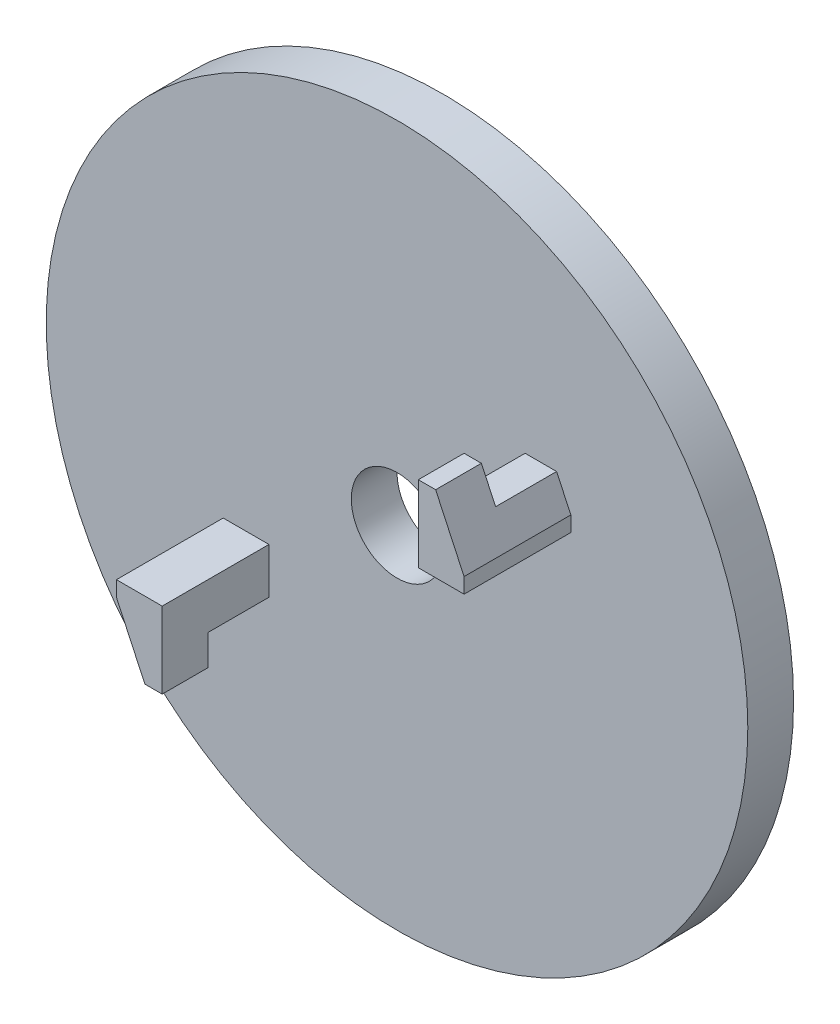
ISO-10303-21;
HEADER;
FILE_DESCRIPTION(('STEP AP214'),'2;1');
FILE_NAME('part.step','',(''),(''),'','','');
FILE_SCHEMA(('AUTOMOTIVE_DESIGN { 1 0 10303 214 1 1 1 1 }'));
ENDSEC;
DATA;
#1=APPLICATION_CONTEXT('core data for automotive mechanical design processes');
#2=APPLICATION_PROTOCOL_DEFINITION('international standard','automotive_design',2000,#1);
#3=PRODUCT_CONTEXT('',#1,'mechanical');
#4=PRODUCT('Part','Part','',(#3));
#5=PRODUCT_RELATED_PRODUCT_CATEGORY('part','',(#4));
#6=PRODUCT_DEFINITION_FORMATION('','',#4);
#7=PRODUCT_DEFINITION_CONTEXT('part definition',#1,'design');
#8=PRODUCT_DEFINITION('design','',#6,#7);
#9=PRODUCT_DEFINITION_SHAPE('','',#8);
#10=(LENGTH_UNIT() NAMED_UNIT(*) SI_UNIT(.MILLI.,.METRE.));
#11=(NAMED_UNIT(*) PLANE_ANGLE_UNIT() SI_UNIT($,.RADIAN.));
#12=(NAMED_UNIT(*) SI_UNIT($,.STERADIAN.) SOLID_ANGLE_UNIT());
#13=UNCERTAINTY_MEASURE_WITH_UNIT(LENGTH_MEASURE(1.E-05),#10,'distance_accuracy_value','');
#14=(GEOMETRIC_REPRESENTATION_CONTEXT(3) GLOBAL_UNCERTAINTY_ASSIGNED_CONTEXT((#13)) GLOBAL_UNIT_ASSIGNED_CONTEXT((#10,
#11,#12)) REPRESENTATION_CONTEXT('',''));
#15=CARTESIAN_POINT('',(0.,0.,0.));
#16=DIRECTION('',(0.,0.,1.));
#17=DIRECTION('',(1.,0.,0.));
#18=AXIS2_PLACEMENT_3D('',#15,#16,#17);
#19=CARTESIAN_POINT('',(-5.69834179168338,-4.14321580697128,5.));
#20=DIRECTION('',(0.,1.,0.));
#21=DIRECTION('',(0.,0.,1.));
#22=AXIS2_PLACEMENT_3D('',#19,#20,#21);
#23=PLANE('',#22);
#24=DIRECTION('',(1.,0.,0.));
#25=VECTOR('',#24,1.);
#26=CARTESIAN_POINT('',(-4.19834179168338,-4.14321580697128,3.5));
#27=LINE('',#26,#25);
#28=CARTESIAN_POINT('',(-5.23203413352837,-4.14321580697128,3.5));
#29=VERTEX_POINT('',#28);
#30=CARTESIAN_POINT('',(-4.19834179168338,-4.14321580697128,3.5));
#31=VERTEX_POINT('',#30);
#32=EDGE_CURVE('E170',#29,#31,#27,.T.);
#33=ORIENTED_EDGE('',*,*,#32,.F.);
#34=DIRECTION('',(0.,0.,1.));
#35=VECTOR('',#34,1.);
#36=CARTESIAN_POINT('',(-5.23203413352837,-4.14321580697128,0.));
#37=LINE('',#36,#35);
#38=CARTESIAN_POINT('',(-5.23203413352837,-4.14321580697128,1.5));
#39=VERTEX_POINT('',#38);
#40=EDGE_CURVE('E300',#29,#39,#37,.F.);
#41=ORIENTED_EDGE('',*,*,#40,.T.);
#42=DIRECTION('',(1.,0.,0.));
#43=VECTOR('',#42,1.);
#44=CARTESIAN_POINT('',(-5.69834179168338,-4.14321580697128,1.5));
#45=LINE('',#44,#43);
#46=CARTESIAN_POINT('',(-4.19834179168338,-4.14321580697128,1.5));
#47=VERTEX_POINT('',#46);
#48=EDGE_CURVE('E154',#39,#47,#45,.T.);
#49=ORIENTED_EDGE('',*,*,#48,.T.);
#50=DIRECTION('',(0.,0.,-1.));
#51=VECTOR('',#50,1.);
#52=CARTESIAN_POINT('',(-4.19834179168338,-4.14321580697128,5.));
#53=LINE('',#52,#51);
#54=EDGE_CURVE('E204',#31,#47,#53,.T.);
#55=ORIENTED_EDGE('',*,*,#54,.F.);
#56=EDGE_LOOP('',(#33,#41,#49,#55));
#57=FACE_BOUND('',#56,.T.);
#58=ADVANCED_FACE('F39',(#57),#23,.F.);
#59=CARTESIAN_POINT('',(4.19834179168338,4.14321580697128,5.));
#60=DIRECTION('',(0.,-1.,0.));
#61=DIRECTION('',(0.,0.,-1.));
#62=AXIS2_PLACEMENT_3D('',#59,#60,#61);
#63=PLANE('',#62);
#64=DIRECTION('',(-1.,0.,0.));
#65=VECTOR('',#64,1.);
#66=CARTESIAN_POINT('',(5.69834179168338,4.14321580697128,3.5));
#67=LINE('',#66,#65);
#68=CARTESIAN_POINT('',(5.23203413352838,4.14321580697128,3.5));
#69=VERTEX_POINT('',#68);
#70=CARTESIAN_POINT('',(4.19834179168338,4.14321580697128,3.5));
#71=VERTEX_POINT('',#70);
#72=EDGE_CURVE('E180',#69,#71,#67,.T.);
#73=ORIENTED_EDGE('',*,*,#72,.F.);
#74=DIRECTION('',(0.,0.,-1.));
#75=VECTOR('',#74,1.);
#76=CARTESIAN_POINT('',(5.23203413352838,4.14321580697128,0.));
#77=LINE('',#76,#75);
#78=CARTESIAN_POINT('',(5.23203413352838,4.14321580697128,1.5));
#79=VERTEX_POINT('',#78);
#80=EDGE_CURVE('E282',#69,#79,#77,.T.);
#81=ORIENTED_EDGE('',*,*,#80,.T.);
#82=DIRECTION('',(-1.,0.,0.));
#83=VECTOR('',#82,1.);
#84=CARTESIAN_POINT('',(4.19834179168338,4.14321580697128,1.5));
#85=LINE('',#84,#83);
#86=CARTESIAN_POINT('',(4.19834179168338,4.14321580697128,1.5));
#87=VERTEX_POINT('',#86);
#88=EDGE_CURVE('E240',#79,#87,#85,.T.);
#89=ORIENTED_EDGE('',*,*,#88,.T.);
#90=DIRECTION('',(0.,0.,-1.));
#91=VECTOR('',#90,1.);
#92=CARTESIAN_POINT('',(4.19834179168338,4.14321580697128,5.));
#93=LINE('',#92,#91);
#94=EDGE_CURVE('E255',#71,#87,#93,.T.);
#95=ORIENTED_EDGE('',*,*,#94,.F.);
#96=EDGE_LOOP('',(#73,#81,#89,#95));
#97=FACE_BOUND('',#96,.T.);
#98=ADVANCED_FACE('F330',(#97),#63,.F.);
#99=CARTESIAN_POINT('',(0.,0.,1.5));
#100=DIRECTION('',(0.,0.,1.));
#101=DIRECTION('',(1.,0.,0.));
#102=AXIS2_PLACEMENT_3D('',#99,#100,#101);
#103=PLANE('',#102);
#104=CARTESIAN_POINT('',(0.,0.,1.5));
#105=DIRECTION('',(0.,0.,1.));
#106=DIRECTION('',(1.,0.,0.));
#107=AXIS2_PLACEMENT_3D('',#104,#105,#106);
#108=CIRCLE('',#107,11.5);
#109=CARTESIAN_POINT('',(11.5,0.,1.5));
#110=VERTEX_POINT('',#109);
#111=EDGE_CURVE('E268',#110,#110,#108,.T.);
#112=ORIENTED_EDGE('',*,*,#111,.T.);
#113=EDGE_LOOP('',(#112));
#114=FACE_BOUND('',#113,.T.);
#115=CARTESIAN_POINT('',(0.,0.,1.5));
#116=DIRECTION('',(0.,0.,1.));
#117=DIRECTION('',(1.,0.,0.));
#118=AXIS2_PLACEMENT_3D('',#115,#116,#117);
#119=CIRCLE('',#118,1.5);
#120=CARTESIAN_POINT('',(1.5,0.,1.5));
#121=VERTEX_POINT('',#120);
#122=EDGE_CURVE('E260',#121,#121,#119,.T.);
#123=ORIENTED_EDGE('',*,*,#122,.F.);
#124=EDGE_LOOP('',(#123));
#125=FACE_BOUND('',#124,.T.);
#126=ORIENTED_EDGE('',*,*,#88,.F.);
#127=DIRECTION('',(0.422618261740697,-0.906307787036651,0.));
#128=VECTOR('',#127,1.);
#129=CARTESIAN_POINT('',(4.76572647537338,5.14321580697128,1.5));
#130=LINE('',#129,#128);
#131=CARTESIAN_POINT('',(5.69834179168338,3.14321580697126,1.5));
#132=VERTEX_POINT('',#131);
#133=EDGE_CURVE('E291',#79,#132,#130,.T.);
#134=ORIENTED_EDGE('',*,*,#133,.T.);
#135=DIRECTION('',(0.,1.,0.));
#136=VECTOR('',#135,1.);
#137=CARTESIAN_POINT('',(5.69834179168338,4.14321580697128,1.5));
#138=LINE('',#137,#136);
#139=CARTESIAN_POINT('',(5.69834179168338,2.64321580697128,1.5));
#140=VERTEX_POINT('',#139);
#141=EDGE_CURVE('E224',#140,#132,#138,.T.);
#142=ORIENTED_EDGE('',*,*,#141,.F.);
#143=DIRECTION('',(1.,0.,0.));
#144=VECTOR('',#143,1.);
#145=CARTESIAN_POINT('',(4.19834179168338,2.64321580697128,1.5));
#146=LINE('',#145,#144);
#147=CARTESIAN_POINT('',(4.19834179168338,2.64321580697128,1.5));
#148=VERTEX_POINT('',#147);
#149=EDGE_CURVE('E230',#148,#140,#146,.T.);
#150=ORIENTED_EDGE('',*,*,#149,.F.);
#151=DIRECTION('',(0.,-1.,0.));
#152=VECTOR('',#151,1.);
#153=CARTESIAN_POINT('',(4.19834179168338,4.14321580697128,1.5));
#154=LINE('',#153,#152);
#155=EDGE_CURVE('E243',#87,#148,#154,.T.);
#156=ORIENTED_EDGE('',*,*,#155,.F.);
#157=EDGE_LOOP('',(#126,#134,#142,#150,#156));
#158=FACE_BOUND('',#157,.T.);
#159=DIRECTION('',(-1.,0.,0.));
#160=VECTOR('',#159,1.);
#161=CARTESIAN_POINT('',(-5.69834179168338,-2.64321580697128,1.5));
#162=LINE('',#161,#160);
#163=CARTESIAN_POINT('',(-4.19834179168338,-2.64321580697128,1.5));
#164=VERTEX_POINT('',#163);
#165=CARTESIAN_POINT('',(-5.69834179168338,-2.64321580697128,1.5));
#166=VERTEX_POINT('',#165);
#167=EDGE_CURVE('E207',#164,#166,#162,.T.);
#168=ORIENTED_EDGE('',*,*,#167,.F.);
#169=DIRECTION('',(0.,1.,0.));
#170=VECTOR('',#169,1.);
#171=CARTESIAN_POINT('',(-4.19834179168338,-2.64321580697128,1.5));
#172=LINE('',#171,#170);
#173=EDGE_CURVE('E197',#47,#164,#172,.T.);
#174=ORIENTED_EDGE('',*,*,#173,.F.);
#175=ORIENTED_EDGE('',*,*,#48,.F.);
#176=DIRECTION('',(0.422618261740697,-0.906307787036651,0.));
#177=VECTOR('',#176,1.);
#178=CARTESIAN_POINT('',(-4.76572647537338,-5.14321580697128,1.5));
#179=LINE('',#178,#177);
#180=CARTESIAN_POINT('',(-5.69834179168338,-3.14321580697126,1.5));
#181=VERTEX_POINT('',#180);
#182=EDGE_CURVE('E11',#39,#181,#179,.F.);
#183=ORIENTED_EDGE('',*,*,#182,.T.);
#184=DIRECTION('',(0.,-1.,0.));
#185=VECTOR('',#184,1.);
#186=CARTESIAN_POINT('',(-5.69834179168338,-2.64321580697128,1.5));
#187=LINE('',#186,#185);
#188=EDGE_CURVE('E210',#166,#181,#187,.T.);
#189=ORIENTED_EDGE('',*,*,#188,.F.);
#190=EDGE_LOOP('',(#168,#174,#175,#183,#189));
#191=FACE_BOUND('',#190,.T.);
#192=ADVANCED_FACE('F312',(#114,#125,#158,#191),#103,.T.);
#193=CARTESIAN_POINT('',(0.,0.,0.));
#194=DIRECTION('',(0.,0.,1.));
#195=DIRECTION('',(1.,0.,0.));
#196=AXIS2_PLACEMENT_3D('',#193,#194,#195);
#197=PLANE('',#196);
#198=CARTESIAN_POINT('',(0.,0.,0.));
#199=DIRECTION('',(0.,0.,1.));
#200=DIRECTION('',(1.,0.,0.));
#201=AXIS2_PLACEMENT_3D('',#198,#199,#200);
#202=CIRCLE('',#201,11.5);
#203=CARTESIAN_POINT('',(11.5,0.,0.));
#204=VERTEX_POINT('',#203);
#205=EDGE_CURVE('E264',#204,#204,#202,.T.);
#206=ORIENTED_EDGE('',*,*,#205,.F.);
#207=EDGE_LOOP('',(#206));
#208=FACE_BOUND('',#207,.T.);
#209=CARTESIAN_POINT('',(0.,0.,0.));
#210=DIRECTION('',(0.,0.,1.));
#211=DIRECTION('',(1.,0.,0.));
#212=AXIS2_PLACEMENT_3D('',#209,#210,#211);
#213=CIRCLE('',#212,1.5);
#214=CARTESIAN_POINT('',(1.5,0.,0.));
#215=VERTEX_POINT('',#214);
#216=EDGE_CURVE('E259',#215,#215,#213,.T.);
#217=ORIENTED_EDGE('',*,*,#216,.T.);
#218=EDGE_LOOP('',(#217));
#219=FACE_BOUND('',#218,.T.);
#220=ADVANCED_FACE('F385',(#208,#219),#197,.F.);
#221=CARTESIAN_POINT('',(0.,0.,1.5));
#222=DIRECTION('',(0.,0.,-1.));
#223=DIRECTION('',(-1.,0.,0.));
#224=AXIS2_PLACEMENT_3D('',#221,#222,#223);
#225=CYLINDRICAL_SURFACE('',#224,11.5);
#226=ORIENTED_EDGE('',*,*,#111,.F.);
#227=EDGE_LOOP('',(#226));
#228=FACE_BOUND('',#227,.T.);
#229=ORIENTED_EDGE('',*,*,#205,.T.);
#230=EDGE_LOOP('',(#229));
#231=FACE_BOUND('',#230,.T.);
#232=ADVANCED_FACE('F484',(#228,#231),#225,.T.);
#233=CARTESIAN_POINT('',(0.,0.,1.5));
#234=DIRECTION('',(0.,0.,-1.));
#235=DIRECTION('',(-1.,0.,0.));
#236=AXIS2_PLACEMENT_3D('',#233,#234,#235);
#237=CYLINDRICAL_SURFACE('',#236,1.5);
#238=ORIENTED_EDGE('',*,*,#122,.T.);
#239=EDGE_LOOP('',(#238));
#240=FACE_BOUND('',#239,.T.);
#241=ORIENTED_EDGE('',*,*,#216,.F.);
#242=EDGE_LOOP('',(#241));
#243=FACE_BOUND('',#242,.T.);
#244=ADVANCED_FACE('F446',(#240,#243),#237,.F.);
#245=CARTESIAN_POINT('',(5.69834179168338,4.14321580697128,5.));
#246=DIRECTION('',(-1.,0.,0.));
#247=DIRECTION('',(0.,-1.,0.));
#248=AXIS2_PLACEMENT_3D('',#245,#246,#247);
#249=PLANE('',#248);
#250=ORIENTED_EDGE('',*,*,#141,.T.);
#251=DIRECTION('',(0.,0.,1.));
#252=VECTOR('',#251,1.);
#253=CARTESIAN_POINT('',(5.69834179168338,3.14321580697126,5.));
#254=LINE('',#253,#252);
#255=CARTESIAN_POINT('',(5.69834179168338,3.14321580697126,5.));
#256=VERTEX_POINT('',#255);
#257=EDGE_CURVE('E285',#132,#256,#254,.T.);
#258=ORIENTED_EDGE('',*,*,#257,.T.);
#259=DIRECTION('',(0.,1.,0.));
#260=VECTOR('',#259,1.);
#261=CARTESIAN_POINT('',(5.69834179168338,4.14321580697128,5.));
#262=LINE('',#261,#260);
#263=CARTESIAN_POINT('',(5.69834179168338,2.64321580697128,5.));
#264=VERTEX_POINT('',#263);
#265=EDGE_CURVE('E225',#264,#256,#262,.T.);
#266=ORIENTED_EDGE('',*,*,#265,.F.);
#267=DIRECTION('',(0.,0.,-1.));
#268=VECTOR('',#267,1.);
#269=CARTESIAN_POINT('',(5.69834179168338,2.64321580697128,5.));
#270=LINE('',#269,#268);
#271=EDGE_CURVE('E236',#264,#140,#270,.T.);
#272=ORIENTED_EDGE('',*,*,#271,.T.);
#273=EDGE_LOOP('',(#250,#258,#266,#272));
#274=FACE_BOUND('',#273,.T.);
#275=ADVANCED_FACE('F440',(#274),#249,.F.);
#276=CARTESIAN_POINT('',(4.19834179168338,4.14321580697128,5.));
#277=DIRECTION('',(1.,0.,0.));
#278=DIRECTION('',(0.,0.,-1.));
#279=AXIS2_PLACEMENT_3D('',#276,#277,#278);
#280=PLANE('',#279);
#281=ORIENTED_EDGE('',*,*,#155,.T.);
#282=DIRECTION('',(0.,0.,-1.));
#283=VECTOR('',#282,1.);
#284=CARTESIAN_POINT('',(4.19834179168338,2.64321580697128,5.));
#285=LINE('',#284,#283);
#286=CARTESIAN_POINT('',(4.19834179168338,2.64321580697128,5.));
#287=VERTEX_POINT('',#286);
#288=EDGE_CURVE('E252',#287,#148,#285,.T.);
#289=ORIENTED_EDGE('',*,*,#288,.F.);
#290=DIRECTION('',(0.,-1.,0.));
#291=VECTOR('',#290,1.);
#292=CARTESIAN_POINT('',(4.19834179168338,4.14321580697128,5.));
#293=LINE('',#292,#291);
#294=CARTESIAN_POINT('',(4.19834179168338,5.14321580697128,5.));
#295=VERTEX_POINT('',#294);
#296=EDGE_CURVE('E229',#295,#287,#293,.T.);
#297=ORIENTED_EDGE('',*,*,#296,.F.);
#298=DIRECTION('',(0.,0.,1.));
#299=VECTOR('',#298,1.);
#300=CARTESIAN_POINT('',(4.19834179168338,5.14321580697128,5.));
#301=LINE('',#300,#299);
#302=CARTESIAN_POINT('',(4.19834179168338,5.14321580697128,3.5));
#303=VERTEX_POINT('',#302);
#304=EDGE_CURVE('E184',#303,#295,#301,.T.);
#305=ORIENTED_EDGE('',*,*,#304,.F.);
#306=DIRECTION('',(0.,-1.,0.));
#307=VECTOR('',#306,1.);
#308=CARTESIAN_POINT('',(4.19834179168338,5.14321580697128,3.5));
#309=LINE('',#308,#307);
#310=EDGE_CURVE('E192',#303,#71,#309,.T.);
#311=ORIENTED_EDGE('',*,*,#310,.T.);
#312=ORIENTED_EDGE('',*,*,#94,.T.);
#313=EDGE_LOOP('',(#281,#289,#297,#305,#311,#312));
#314=FACE_BOUND('',#313,.T.);
#315=ADVANCED_FACE('F445',(#314),#280,.F.);
#316=CARTESIAN_POINT('',(4.19834179168338,2.64321580697128,5.));
#317=DIRECTION('',(0.,1.,0.));
#318=DIRECTION('',(0.,0.,1.));
#319=AXIS2_PLACEMENT_3D('',#316,#317,#318);
#320=PLANE('',#319);
#321=ORIENTED_EDGE('',*,*,#149,.T.);
#322=ORIENTED_EDGE('',*,*,#271,.F.);
#323=DIRECTION('',(1.,0.,0.));
#324=VECTOR('',#323,1.);
#325=CARTESIAN_POINT('',(4.19834179168338,2.64321580697128,5.));
#326=LINE('',#325,#324);
#327=EDGE_CURVE('E233',#287,#264,#326,.T.);
#328=ORIENTED_EDGE('',*,*,#327,.F.);
#329=ORIENTED_EDGE('',*,*,#288,.T.);
#330=EDGE_LOOP('',(#321,#322,#328,#329));
#331=FACE_BOUND('',#330,.T.);
#332=ADVANCED_FACE('F431',(#331),#320,.F.);
#333=CARTESIAN_POINT('',(0.,0.,5.));
#334=DIRECTION('',(0.,0.,1.));
#335=DIRECTION('',(1.,0.,0.));
#336=AXIS2_PLACEMENT_3D('',#333,#334,#335);
#337=PLANE('',#336);
#338=ORIENTED_EDGE('',*,*,#265,.T.);
#339=DIRECTION('',(-0.422618261740697,0.906307787036651,0.));
#340=VECTOR('',#339,1.);
#341=CARTESIAN_POINT('',(5.88450414679527,2.74398934809546,5.));
#342=LINE('',#341,#340);
#343=CARTESIAN_POINT('',(4.76572647537338,5.14321580697128,5.));
#344=VERTEX_POINT('',#343);
#345=EDGE_CURVE('E288',#256,#344,#342,.T.);
#346=ORIENTED_EDGE('',*,*,#345,.T.);
#347=DIRECTION('',(1.,0.,0.));
#348=VECTOR('',#347,1.);
#349=CARTESIAN_POINT('',(5.69834179168338,5.14321580697128,5.));
#350=LINE('',#349,#348);
#351=EDGE_CURVE('E188',#295,#344,#350,.T.);
#352=ORIENTED_EDGE('',*,*,#351,.F.);
#353=ORIENTED_EDGE('',*,*,#296,.T.);
#354=ORIENTED_EDGE('',*,*,#327,.T.);
#355=EDGE_LOOP('',(#338,#346,#352,#353,#354));
#356=FACE_BOUND('',#355,.T.);
#357=ADVANCED_FACE('F403',(#356),#337,.T.);
#358=CARTESIAN_POINT('',(-4.19834179168338,-2.64321580697128,5.));
#359=DIRECTION('',(-1.,0.,0.));
#360=DIRECTION('',(0.,0.,1.));
#361=AXIS2_PLACEMENT_3D('',#358,#359,#360);
#362=PLANE('',#361);
#363=ORIENTED_EDGE('',*,*,#173,.T.);
#364=DIRECTION('',(0.,0.,-1.));
#365=VECTOR('',#364,1.);
#366=CARTESIAN_POINT('',(-4.19834179168338,-2.64321580697128,5.));
#367=LINE('',#366,#365);
#368=CARTESIAN_POINT('',(-4.19834179168338,-2.64321580697128,5.));
#369=VERTEX_POINT('',#368);
#370=EDGE_CURVE('E150',#369,#164,#367,.T.);
#371=ORIENTED_EDGE('',*,*,#370,.F.);
#372=DIRECTION('',(0.,1.,0.));
#373=VECTOR('',#372,1.);
#374=CARTESIAN_POINT('',(-4.19834179168338,-2.64321580697128,5.));
#375=LINE('',#374,#373);
#376=CARTESIAN_POINT('',(-4.19834179168338,-5.14321580697128,5.));
#377=VERTEX_POINT('',#376);
#378=EDGE_CURVE('E143',#377,#369,#375,.T.);
#379=ORIENTED_EDGE('',*,*,#378,.F.);
#380=DIRECTION('',(0.,0.,1.));
#381=VECTOR('',#380,1.);
#382=CARTESIAN_POINT('',(-4.19834179168338,-5.14321580697128,5.));
#383=LINE('',#382,#381);
#384=CARTESIAN_POINT('',(-4.19834179168338,-5.14321580697128,3.5));
#385=VERTEX_POINT('',#384);
#386=EDGE_CURVE('E149',#385,#377,#383,.T.);
#387=ORIENTED_EDGE('',*,*,#386,.F.);
#388=DIRECTION('',(0.,1.,0.));
#389=VECTOR('',#388,1.);
#390=CARTESIAN_POINT('',(-4.19834179168338,-5.14321580697128,3.5));
#391=LINE('',#390,#389);
#392=EDGE_CURVE('E176',#385,#31,#391,.T.);
#393=ORIENTED_EDGE('',*,*,#392,.T.);
#394=ORIENTED_EDGE('',*,*,#54,.T.);
#395=EDGE_LOOP('',(#363,#371,#379,#387,#393,#394));
#396=FACE_BOUND('',#395,.T.);
#397=ADVANCED_FACE('F146',(#396),#362,.F.);
#398=CARTESIAN_POINT('',(-5.69834179168338,-2.64321580697128,5.));
#399=DIRECTION('',(0.,-1.,0.));
#400=DIRECTION('',(0.,0.,-1.));
#401=AXIS2_PLACEMENT_3D('',#398,#399,#400);
#402=PLANE('',#401);
#403=ORIENTED_EDGE('',*,*,#167,.T.);
#404=DIRECTION('',(0.,0.,-1.));
#405=VECTOR('',#404,1.);
#406=CARTESIAN_POINT('',(-5.69834179168338,-2.64321580697128,5.));
#407=LINE('',#406,#405);
#408=CARTESIAN_POINT('',(-5.69834179168338,-2.64321580697128,5.));
#409=VERTEX_POINT('',#408);
#410=EDGE_CURVE('E218',#409,#166,#407,.T.);
#411=ORIENTED_EDGE('',*,*,#410,.F.);
#412=DIRECTION('',(-1.,0.,0.));
#413=VECTOR('',#412,1.);
#414=CARTESIAN_POINT('',(-5.69834179168338,-2.64321580697128,5.));
#415=LINE('',#414,#413);
#416=EDGE_CURVE('E153',#369,#409,#415,.T.);
#417=ORIENTED_EDGE('',*,*,#416,.F.);
#418=ORIENTED_EDGE('',*,*,#370,.T.);
#419=EDGE_LOOP('',(#403,#411,#417,#418));
#420=FACE_BOUND('',#419,.T.);
#421=ADVANCED_FACE('F317',(#420),#402,.F.);
#422=CARTESIAN_POINT('',(-5.69834179168338,-2.64321580697128,5.));
#423=DIRECTION('',(1.,0.,0.));
#424=DIRECTION('',(0.,0.,-1.));
#425=AXIS2_PLACEMENT_3D('',#422,#423,#424);
#426=PLANE('',#425);
#427=ORIENTED_EDGE('',*,*,#188,.T.);
#428=DIRECTION('',(0.,0.,1.));
#429=VECTOR('',#428,1.);
#430=CARTESIAN_POINT('',(-5.69834179168338,-3.14321580697126,5.));
#431=LINE('',#430,#429);
#432=CARTESIAN_POINT('',(-5.69834179168338,-3.14321580697126,5.));
#433=VERTEX_POINT('',#432);
#434=EDGE_CURVE('E55',#181,#433,#431,.T.);
#435=ORIENTED_EDGE('',*,*,#434,.T.);
#436=DIRECTION('',(0.,-1.,0.));
#437=VECTOR('',#436,1.);
#438=CARTESIAN_POINT('',(-5.69834179168338,-2.64321580697128,5.));
#439=LINE('',#438,#437);
#440=EDGE_CURVE('E201',#409,#433,#439,.T.);
#441=ORIENTED_EDGE('',*,*,#440,.F.);
#442=ORIENTED_EDGE('',*,*,#410,.T.);
#443=EDGE_LOOP('',(#427,#435,#441,#442));
#444=FACE_BOUND('',#443,.T.);
#445=ADVANCED_FACE('F318',(#444),#426,.F.);
#446=CARTESIAN_POINT('',(0.,0.,5.));
#447=DIRECTION('',(0.,0.,1.));
#448=DIRECTION('',(1.,0.,0.));
#449=AXIS2_PLACEMENT_3D('',#446,#447,#448);
#450=PLANE('',#449);
#451=ORIENTED_EDGE('',*,*,#440,.T.);
#452=DIRECTION('',(-0.422618261740697,0.906307787036651,0.));
#453=VECTOR('',#452,1.);
#454=CARTESIAN_POINT('',(-5.88450414679526,-2.74398934809546,5.));
#455=LINE('',#454,#453);
#456=CARTESIAN_POINT('',(-4.76572647537338,-5.14321580697128,5.));
#457=VERTEX_POINT('',#456);
#458=EDGE_CURVE('E48',#433,#457,#455,.F.);
#459=ORIENTED_EDGE('',*,*,#458,.T.);
#460=DIRECTION('',(-1.,0.,0.));
#461=VECTOR('',#460,1.);
#462=CARTESIAN_POINT('',(-4.19834179168338,-5.14321580697128,5.));
#463=LINE('',#462,#461);
#464=EDGE_CURVE('E157',#377,#457,#463,.T.);
#465=ORIENTED_EDGE('',*,*,#464,.F.);
#466=ORIENTED_EDGE('',*,*,#378,.T.);
#467=ORIENTED_EDGE('',*,*,#416,.T.);
#468=EDGE_LOOP('',(#451,#459,#465,#466,#467));
#469=FACE_BOUND('',#468,.T.);
#470=ADVANCED_FACE('F158',(#469),#450,.T.);
#471=CARTESIAN_POINT('',(5.69834179168338,5.14321580697128,3.5));
#472=DIRECTION('',(0.,0.,1.));
#473=DIRECTION('',(1.,0.,0.));
#474=AXIS2_PLACEMENT_3D('',#471,#472,#473);
#475=PLANE('',#474);
#476=DIRECTION('',(-1.,0.,0.));
#477=VECTOR('',#476,1.);
#478=CARTESIAN_POINT('',(5.69834179168338,5.14321580697128,3.5));
#479=LINE('',#478,#477);
#480=CARTESIAN_POINT('',(4.76572647537338,5.14321580697128,3.5));
#481=VERTEX_POINT('',#480);
#482=EDGE_CURVE('E181',#481,#303,#479,.T.);
#483=ORIENTED_EDGE('',*,*,#482,.F.);
#484=DIRECTION('',(0.422618261740697,-0.906307787036651,0.));
#485=VECTOR('',#484,1.);
#486=CARTESIAN_POINT('',(4.76572647537338,5.14321580697128,3.5));
#487=LINE('',#486,#485);
#488=EDGE_CURVE('E279',#481,#69,#487,.T.);
#489=ORIENTED_EDGE('',*,*,#488,.T.);
#490=ORIENTED_EDGE('',*,*,#72,.T.);
#491=ORIENTED_EDGE('',*,*,#310,.F.);
#492=EDGE_LOOP('',(#483,#489,#490,#491));
#493=FACE_BOUND('',#492,.T.);
#494=ADVANCED_FACE('F325',(#493),#475,.F.);
#495=CARTESIAN_POINT('',(0.,5.14321580697128,0.));
#496=DIRECTION('',(0.,1.,0.));
#497=DIRECTION('',(0.,0.,1.));
#498=AXIS2_PLACEMENT_3D('',#495,#496,#497);
#499=PLANE('',#498);
#500=ORIENTED_EDGE('',*,*,#351,.T.);
#501=DIRECTION('',(0.,0.,-1.));
#502=VECTOR('',#501,1.);
#503=CARTESIAN_POINT('',(4.76572647537338,5.14321580697128,3.5));
#504=LINE('',#503,#502);
#505=EDGE_CURVE('E272',#344,#481,#504,.T.);
#506=ORIENTED_EDGE('',*,*,#505,.T.);
#507=ORIENTED_EDGE('',*,*,#482,.T.);
#508=ORIENTED_EDGE('',*,*,#304,.T.);
#509=EDGE_LOOP('',(#500,#506,#507,#508));
#510=FACE_BOUND('',#509,.T.);
#511=ADVANCED_FACE('F339',(#510),#499,.T.);
#512=CARTESIAN_POINT('',(4.76572647537338,5.14321580697128,0.));
#513=DIRECTION('',(0.906307787036651,0.422618261740697,0.));
#514=DIRECTION('',(0.,0.,1.));
#515=AXIS2_PLACEMENT_3D('',#512,#513,#514);
#516=PLANE('',#515);
#517=ORIENTED_EDGE('',*,*,#345,.F.);
#518=ORIENTED_EDGE('',*,*,#257,.F.);
#519=ORIENTED_EDGE('',*,*,#133,.F.);
#520=ORIENTED_EDGE('',*,*,#80,.F.);
#521=ORIENTED_EDGE('',*,*,#488,.F.);
#522=ORIENTED_EDGE('',*,*,#505,.F.);
#523=EDGE_LOOP('',(#517,#518,#519,#520,#521,#522));
#524=FACE_BOUND('',#523,.T.);
#525=ADVANCED_FACE('F343',(#524),#516,.T.);
#526=CARTESIAN_POINT('',(-4.19834179168338,-5.14321580697128,3.5));
#527=DIRECTION('',(0.,0.,1.));
#528=DIRECTION('',(1.,0.,0.));
#529=AXIS2_PLACEMENT_3D('',#526,#527,#528);
#530=PLANE('',#529);
#531=DIRECTION('',(1.,0.,0.));
#532=VECTOR('',#531,1.);
#533=CARTESIAN_POINT('',(-4.19834179168338,-5.14321580697128,3.5));
#534=LINE('',#533,#532);
#535=CARTESIAN_POINT('',(-4.76572647537338,-5.14321580697128,3.5));
#536=VERTEX_POINT('',#535);
#537=EDGE_CURVE('E164',#536,#385,#534,.T.);
#538=ORIENTED_EDGE('',*,*,#537,.F.);
#539=DIRECTION('',(0.422618261740697,-0.906307787036651,0.));
#540=VECTOR('',#539,1.);
#541=CARTESIAN_POINT('',(-4.76572647537338,-5.14321580697128,3.5));
#542=LINE('',#541,#540);
#543=EDGE_CURVE('E297',#536,#29,#542,.F.);
#544=ORIENTED_EDGE('',*,*,#543,.T.);
#545=ORIENTED_EDGE('',*,*,#32,.T.);
#546=ORIENTED_EDGE('',*,*,#392,.F.);
#547=EDGE_LOOP('',(#538,#544,#545,#546));
#548=FACE_BOUND('',#547,.T.);
#549=ADVANCED_FACE('F314',(#548),#530,.F.);
#550=CARTESIAN_POINT('',(0.,-5.14321580697128,0.));
#551=DIRECTION('',(0.,1.,0.));
#552=DIRECTION('',(0.,0.,1.));
#553=AXIS2_PLACEMENT_3D('',#550,#551,#552);
#554=PLANE('',#553);
#555=ORIENTED_EDGE('',*,*,#464,.T.);
#556=DIRECTION('',(0.,0.,-1.));
#557=VECTOR('',#556,1.);
#558=CARTESIAN_POINT('',(-4.76572647537338,-5.14321580697128,0.));
#559=LINE('',#558,#557);
#560=EDGE_CURVE('E294',#457,#536,#559,.T.);
#561=ORIENTED_EDGE('',*,*,#560,.T.);
#562=ORIENTED_EDGE('',*,*,#537,.T.);
#563=ORIENTED_EDGE('',*,*,#386,.T.);
#564=EDGE_LOOP('',(#555,#561,#562,#563));
#565=FACE_BOUND('',#564,.T.);
#566=ADVANCED_FACE('F166',(#565),#554,.F.);
#567=CARTESIAN_POINT('',(-4.76572647537338,-5.14321580697128,0.));
#568=DIRECTION('',(0.906307787036651,0.422618261740697,0.));
#569=DIRECTION('',(0.,0.,-1.));
#570=AXIS2_PLACEMENT_3D('',#567,#568,#569);
#571=PLANE('',#570);
#572=ORIENTED_EDGE('',*,*,#458,.F.);
#573=ORIENTED_EDGE('',*,*,#434,.F.);
#574=ORIENTED_EDGE('',*,*,#182,.F.);
#575=ORIENTED_EDGE('',*,*,#40,.F.);
#576=ORIENTED_EDGE('',*,*,#543,.F.);
#577=ORIENTED_EDGE('',*,*,#560,.F.);
#578=EDGE_LOOP('',(#572,#573,#574,#575,#576,#577));
#579=FACE_BOUND('',#578,.T.);
#580=ADVANCED_FACE('F41',(#579),#571,.F.);
#581=CLOSED_SHELL('',(#58,#98,#192,#220,#232,#244,#275,#315,#332,#357,#397,#421,#445,#470,#494,
#511,#525,#549,#566,#580));
#582=MANIFOLD_SOLID_BREP('B2',#581);
#583=ADVANCED_BREP_SHAPE_REPRESENTATION('',(#18,#582),#14);
#584=SHAPE_DEFINITION_REPRESENTATION(#9,#583);
ENDSEC;
END-ISO-10303-21;
